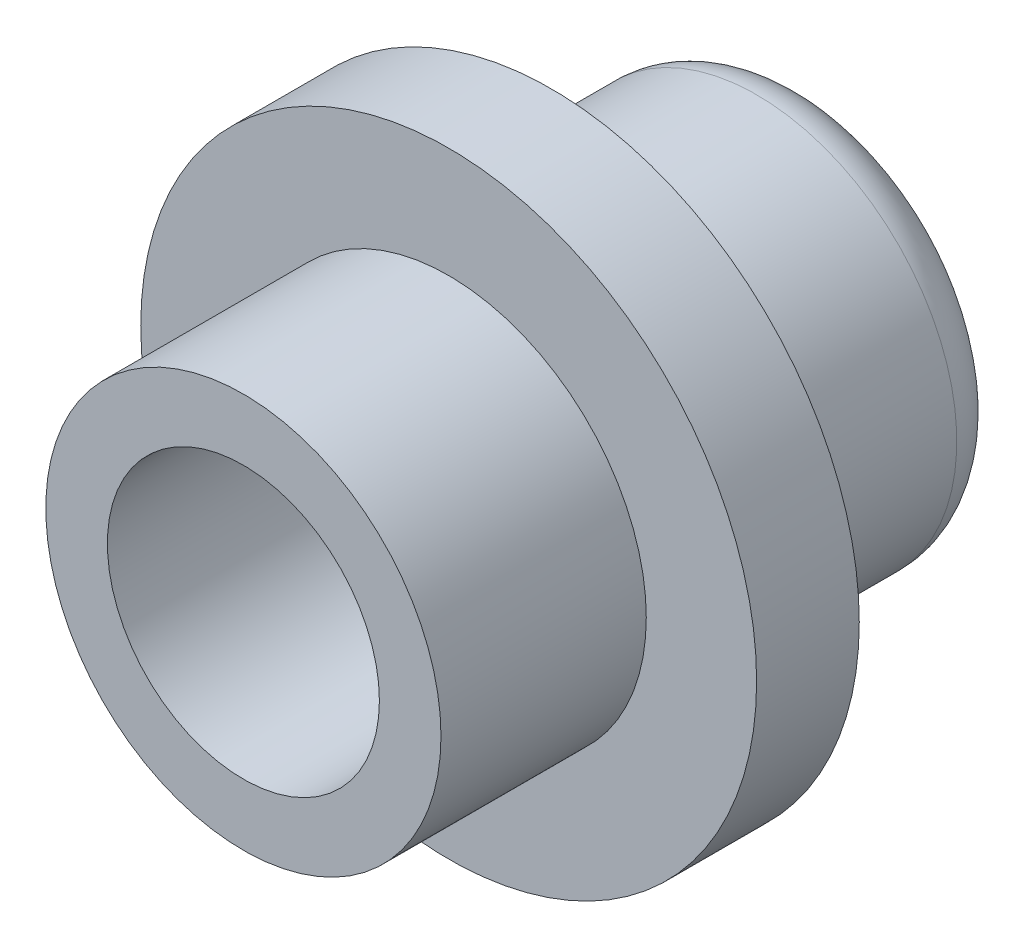
ISO-10303-21;
HEADER;
FILE_DESCRIPTION(('STEP AP214'),'2;1');
FILE_NAME('part.step','',(''),(''),'','','');
FILE_SCHEMA(('AUTOMOTIVE_DESIGN { 1 0 10303 214 1 1 1 1 }'));
ENDSEC;
DATA;
#1=APPLICATION_CONTEXT('core data for automotive mechanical design processes');
#2=APPLICATION_PROTOCOL_DEFINITION('international standard','automotive_design',2000,#1);
#3=PRODUCT_CONTEXT('',#1,'mechanical');
#4=PRODUCT('Part','Part','',(#3));
#5=PRODUCT_RELATED_PRODUCT_CATEGORY('part','',(#4));
#6=PRODUCT_DEFINITION_FORMATION('','',#4);
#7=PRODUCT_DEFINITION_CONTEXT('part definition',#1,'design');
#8=PRODUCT_DEFINITION('design','',#6,#7);
#9=PRODUCT_DEFINITION_SHAPE('','',#8);
#10=(LENGTH_UNIT() NAMED_UNIT(*) SI_UNIT(.MILLI.,.METRE.));
#11=(NAMED_UNIT(*) PLANE_ANGLE_UNIT() SI_UNIT($,.RADIAN.));
#12=(NAMED_UNIT(*) SI_UNIT($,.STERADIAN.) SOLID_ANGLE_UNIT());
#13=UNCERTAINTY_MEASURE_WITH_UNIT(LENGTH_MEASURE(1.E-05),#10,'distance_accuracy_value','');
#14=(GEOMETRIC_REPRESENTATION_CONTEXT(3) GLOBAL_UNCERTAINTY_ASSIGNED_CONTEXT((#13)) GLOBAL_UNIT_ASSIGNED_CONTEXT((#10,
#11,#12)) REPRESENTATION_CONTEXT('',''));
#15=CARTESIAN_POINT('',(0.,0.,0.));
#16=DIRECTION('',(0.,0.,1.));
#17=DIRECTION('',(1.,0.,0.));
#18=AXIS2_PLACEMENT_3D('',#15,#16,#17);
#19=CARTESIAN_POINT('',(0.,0.,5.));
#20=DIRECTION('',(0.,0.,1.));
#21=DIRECTION('',(1.,0.,0.));
#22=AXIS2_PLACEMENT_3D('',#19,#20,#21);
#23=PLANE('',#22);
#24=CARTESIAN_POINT('',(0.,0.,5.));
#25=DIRECTION('',(0.,0.,1.));
#26=DIRECTION('',(1.,0.,0.));
#27=AXIS2_PLACEMENT_3D('',#24,#25,#26);
#28=CIRCLE('',#27,6.);
#29=CARTESIAN_POINT('',(6.,0.,5.));
#30=VERTEX_POINT('',#29);
#31=EDGE_CURVE('E52',#30,#30,#28,.T.);
#32=ORIENTED_EDGE('',*,*,#31,.T.);
#33=EDGE_LOOP('',(#32));
#34=FACE_BOUND('',#33,.T.);
#35=CARTESIAN_POINT('',(0.,0.,5.));
#36=DIRECTION('',(0.,0.,1.));
#37=DIRECTION('',(1.,0.,0.));
#38=AXIS2_PLACEMENT_3D('',#35,#36,#37);
#39=CIRCLE('',#38,3.85);
#40=CARTESIAN_POINT('',(3.85,0.,5.));
#41=VERTEX_POINT('',#40);
#42=EDGE_CURVE('E58',#41,#41,#39,.T.);
#43=ORIENTED_EDGE('',*,*,#42,.F.);
#44=EDGE_LOOP('',(#43));
#45=FACE_BOUND('',#44,.T.);
#46=ADVANCED_FACE('F31',(#34,#45),#23,.T.);
#47=CARTESIAN_POINT('',(0.,0.,5.));
#48=DIRECTION('',(0.,0.,-1.));
#49=DIRECTION('',(-1.,0.,0.));
#50=AXIS2_PLACEMENT_3D('',#47,#48,#49);
#51=CYLINDRICAL_SURFACE('',#50,3.9);
#52=CARTESIAN_POINT('',(0.,0.,-1.));
#53=DIRECTION('',(0.,0.,-1.));
#54=DIRECTION('',(-1.,0.,0.));
#55=AXIS2_PLACEMENT_3D('',#52,#53,#54);
#56=CIRCLE('',#55,3.9);
#57=CARTESIAN_POINT('',(-3.9,0.,-1.));
#58=VERTEX_POINT('',#57);
#59=EDGE_CURVE('E10',#58,#58,#56,.F.);
#60=ORIENTED_EDGE('',*,*,#59,.T.);
#61=EDGE_LOOP('',(#60));
#62=FACE_BOUND('',#61,.T.);
#63=CARTESIAN_POINT('',(0.,0.,3.));
#64=DIRECTION('',(0.,0.,1.));
#65=DIRECTION('',(1.,0.,0.));
#66=AXIS2_PLACEMENT_3D('',#63,#64,#65);
#67=CIRCLE('',#66,3.9);
#68=CARTESIAN_POINT('',(3.9,0.,3.));
#69=VERTEX_POINT('',#68);
#70=EDGE_CURVE('E42',#69,#69,#67,.T.);
#71=ORIENTED_EDGE('',*,*,#70,.F.);
#72=EDGE_LOOP('',(#71));
#73=FACE_BOUND('',#72,.T.);
#74=ADVANCED_FACE('F84',(#62,#73),#51,.T.);
#75=CARTESIAN_POINT('',(0.,0.,3.));
#76=DIRECTION('',(0.,0.,1.));
#77=DIRECTION('',(1.,0.,0.));
#78=AXIS2_PLACEMENT_3D('',#75,#76,#77);
#79=PLANE('',#78);
#80=CARTESIAN_POINT('',(0.,0.,3.));
#81=DIRECTION('',(0.,0.,1.));
#82=DIRECTION('',(1.,0.,0.));
#83=AXIS2_PLACEMENT_3D('',#80,#81,#82);
#84=CIRCLE('',#83,6.);
#85=CARTESIAN_POINT('',(6.,0.,3.));
#86=VERTEX_POINT('',#85);
#87=EDGE_CURVE('E50',#86,#86,#84,.T.);
#88=ORIENTED_EDGE('',*,*,#87,.F.);
#89=EDGE_LOOP('',(#88));
#90=FACE_BOUND('',#89,.T.);
#91=ORIENTED_EDGE('',*,*,#70,.T.);
#92=EDGE_LOOP('',(#91));
#93=FACE_BOUND('',#92,.T.);
#94=ADVANCED_FACE('F90',(#90,#93),#79,.F.);
#95=CARTESIAN_POINT('',(0.,0.,3.));
#96=DIRECTION('',(0.,0.,1.));
#97=DIRECTION('',(1.,0.,0.));
#98=AXIS2_PLACEMENT_3D('',#95,#96,#97);
#99=CYLINDRICAL_SURFACE('',#98,6.);
#100=ORIENTED_EDGE('',*,*,#87,.T.);
#101=EDGE_LOOP('',(#100));
#102=FACE_BOUND('',#101,.T.);
#103=ORIENTED_EDGE('',*,*,#31,.F.);
#104=EDGE_LOOP('',(#103));
#105=FACE_BOUND('',#104,.T.);
#106=ADVANCED_FACE('F96',(#102,#105),#99,.T.);
#107=CARTESIAN_POINT('',(0.,0.,-2.));
#108=DIRECTION('',(0.,0.,-1.));
#109=DIRECTION('',(-1.,0.,0.));
#110=AXIS2_PLACEMENT_3D('',#107,#108,#109);
#111=PLANE('',#110);
#112=CARTESIAN_POINT('',(0.,0.,-2.));
#113=DIRECTION('',(0.,0.,-1.));
#114=DIRECTION('',(-1.,0.,0.));
#115=AXIS2_PLACEMENT_3D('',#112,#113,#114);
#116=CIRCLE('',#115,2.9);
#117=CARTESIAN_POINT('',(-2.9,0.,-2.));
#118=VERTEX_POINT('',#117);
#119=EDGE_CURVE('E38',#118,#118,#116,.T.);
#120=ORIENTED_EDGE('',*,*,#119,.T.);
#121=EDGE_LOOP('',(#120));
#122=FACE_BOUND('',#121,.T.);
#123=ADVANCED_FACE('F81',(#122),#111,.T.);
#124=CARTESIAN_POINT('',(0.,0.,-1.));
#125=DIRECTION('',(0.,0.,-1.));
#126=DIRECTION('',(-1.,0.,0.));
#127=AXIS2_PLACEMENT_3D('',#124,#125,#126);
#128=TOROIDAL_SURFACE('',#127,2.9,1.);
#129=ORIENTED_EDGE('',*,*,#59,.F.);
#130=EDGE_LOOP('',(#129));
#131=FACE_BOUND('',#130,.T.);
#132=ORIENTED_EDGE('',*,*,#119,.F.);
#133=EDGE_LOOP('',(#132));
#134=FACE_BOUND('',#133,.T.);
#135=ADVANCED_FACE('F33',(#131,#134),#128,.T.);
#136=CARTESIAN_POINT('',(0.,0.,9.));
#137=DIRECTION('',(0.,0.,1.));
#138=DIRECTION('',(1.,0.,0.));
#139=AXIS2_PLACEMENT_3D('',#136,#137,#138);
#140=PLANE('',#139);
#141=CARTESIAN_POINT('',(0.,0.,9.));
#142=DIRECTION('',(0.,0.,1.));
#143=DIRECTION('',(1.,0.,0.));
#144=AXIS2_PLACEMENT_3D('',#141,#142,#143);
#145=CIRCLE('',#144,3.85);
#146=CARTESIAN_POINT('',(3.85,0.,9.));
#147=VERTEX_POINT('',#146);
#148=EDGE_CURVE('E55',#147,#147,#145,.T.);
#149=ORIENTED_EDGE('',*,*,#148,.T.);
#150=EDGE_LOOP('',(#149));
#151=FACE_BOUND('',#150,.T.);
#152=CARTESIAN_POINT('',(0.,0.,9.));
#153=DIRECTION('',(0.,0.,1.));
#154=DIRECTION('',(1.,0.,0.));
#155=AXIS2_PLACEMENT_3D('',#152,#153,#154);
#156=CIRCLE('',#155,2.65);
#157=CARTESIAN_POINT('',(2.65,0.,9.));
#158=VERTEX_POINT('',#157);
#159=EDGE_CURVE('E61',#158,#158,#156,.T.);
#160=ORIENTED_EDGE('',*,*,#159,.F.);
#161=EDGE_LOOP('',(#160));
#162=FACE_BOUND('',#161,.T.);
#163=ADVANCED_FACE('F69',(#151,#162),#140,.T.);
#164=CARTESIAN_POINT('',(0.,0.,9.));
#165=DIRECTION('',(0.,0.,-1.));
#166=DIRECTION('',(-1.,0.,0.));
#167=AXIS2_PLACEMENT_3D('',#164,#165,#166);
#168=CYLINDRICAL_SURFACE('',#167,3.85);
#169=ORIENTED_EDGE('',*,*,#148,.F.);
#170=EDGE_LOOP('',(#169));
#171=FACE_BOUND('',#170,.T.);
#172=ORIENTED_EDGE('',*,*,#42,.T.);
#173=EDGE_LOOP('',(#172));
#174=FACE_BOUND('',#173,.T.);
#175=ADVANCED_FACE('F71',(#171,#174),#168,.T.);
#176=CARTESIAN_POINT('',(0.,0.,0.));
#177=DIRECTION('',(0.,0.,-1.));
#178=DIRECTION('',(-1.,0.,0.));
#179=AXIS2_PLACEMENT_3D('',#176,#177,#178);
#180=PLANE('',#179);
#181=CARTESIAN_POINT('',(0.,0.,0.));
#182=DIRECTION('',(0.,0.,1.));
#183=DIRECTION('',(1.,0.,0.));
#184=AXIS2_PLACEMENT_3D('',#181,#182,#183);
#185=CIRCLE('',#184,2.65);
#186=CARTESIAN_POINT('',(2.65,0.,0.));
#187=VERTEX_POINT('',#186);
#188=EDGE_CURVE('E46',#187,#187,#185,.T.);
#189=ORIENTED_EDGE('',*,*,#188,.T.);
#190=EDGE_LOOP('',(#189));
#191=FACE_BOUND('',#190,.T.);
#192=ADVANCED_FACE('F78',(#191),#180,.F.);
#193=CARTESIAN_POINT('',(0.,0.,5.));
#194=DIRECTION('',(0.,0.,-1.));
#195=DIRECTION('',(-1.,0.,0.));
#196=AXIS2_PLACEMENT_3D('',#193,#194,#195);
#197=CYLINDRICAL_SURFACE('',#196,2.65);
#198=ORIENTED_EDGE('',*,*,#188,.F.);
#199=EDGE_LOOP('',(#198));
#200=FACE_BOUND('',#199,.T.);
#201=ORIENTED_EDGE('',*,*,#159,.T.);
#202=EDGE_LOOP('',(#201));
#203=FACE_BOUND('',#202,.T.);
#204=ADVANCED_FACE('F67',(#200,#203),#197,.F.);
#205=CLOSED_SHELL('',(#46,#74,#94,#106,#123,#135,#163,#175,#192,#204));
#206=MANIFOLD_SOLID_BREP('B2',#205);
#207=ADVANCED_BREP_SHAPE_REPRESENTATION('',(#18,#206),#14);
#208=SHAPE_DEFINITION_REPRESENTATION(#9,#207);
ENDSEC;
END-ISO-10303-21;
